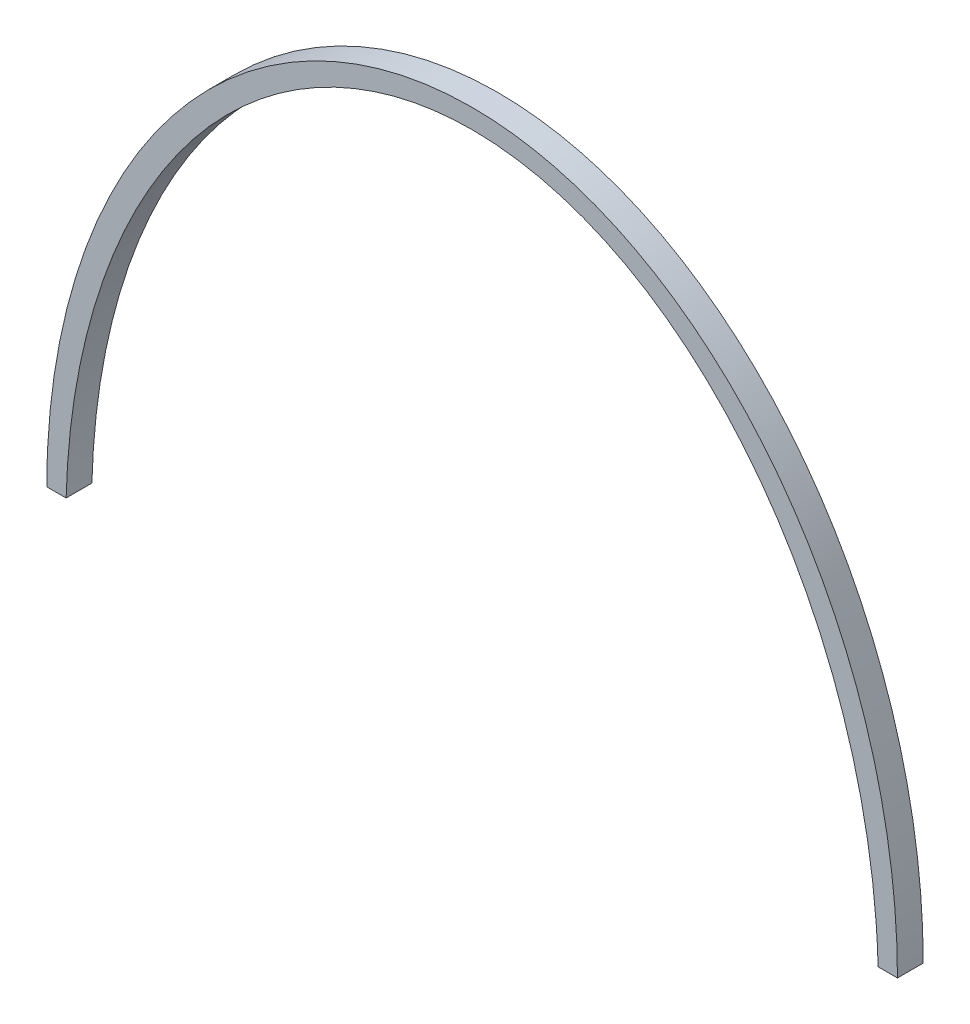
ISO-10303-21;
HEADER;
FILE_DESCRIPTION(('STEP AP214'),'2;1');
FILE_NAME('part.step','',(''),(''),'','','');
FILE_SCHEMA(('AUTOMOTIVE_DESIGN { 1 0 10303 214 1 1 1 1 }'));
ENDSEC;
DATA;
#1=APPLICATION_CONTEXT('core data for automotive mechanical design processes');
#2=APPLICATION_PROTOCOL_DEFINITION('international standard','automotive_design',2000,#1);
#3=PRODUCT_CONTEXT('',#1,'mechanical');
#4=PRODUCT('Part','Part','',(#3));
#5=PRODUCT_RELATED_PRODUCT_CATEGORY('part','',(#4));
#6=PRODUCT_DEFINITION_FORMATION('','',#4);
#7=PRODUCT_DEFINITION_CONTEXT('part definition',#1,'design');
#8=PRODUCT_DEFINITION('design','',#6,#7);
#9=PRODUCT_DEFINITION_SHAPE('','',#8);
#10=(LENGTH_UNIT() NAMED_UNIT(*) SI_UNIT(.MILLI.,.METRE.));
#11=(NAMED_UNIT(*) PLANE_ANGLE_UNIT() SI_UNIT($,.RADIAN.));
#12=(NAMED_UNIT(*) SI_UNIT($,.STERADIAN.) SOLID_ANGLE_UNIT());
#13=UNCERTAINTY_MEASURE_WITH_UNIT(LENGTH_MEASURE(1.E-05),#10,'distance_accuracy_value','');
#14=(GEOMETRIC_REPRESENTATION_CONTEXT(3) GLOBAL_UNCERTAINTY_ASSIGNED_CONTEXT((#13)) GLOBAL_UNIT_ASSIGNED_CONTEXT((#10,
#11,#12)) REPRESENTATION_CONTEXT('',''));
#15=CARTESIAN_POINT('',(0.,0.,0.));
#16=DIRECTION('',(0.,0.,1.));
#17=DIRECTION('',(1.,0.,0.));
#18=AXIS2_PLACEMENT_3D('',#15,#16,#17);
#19=CARTESIAN_POINT('',(2.17766099008993E-13,-19.05,12.7));
#20=DIRECTION('',(0.,0.,-1.));
#21=DIRECTION('',(0.,-1.,0.));
#22=AXIS2_PLACEMENT_3D('',#19,#20,#21);
#23=ELLIPSE('',#22,533.4,400.305378257736);
#24=DIRECTION('',(0.,0.,-1.));
#25=VECTOR('',#24,1.);
#26=SURFACE_OF_LINEAR_EXTRUSION('',#23,#25);
#27=CARTESIAN_POINT('',(2.17766099008993E-13,-19.05,-12.7));
#28=DIRECTION('',(0.,0.,-1.));
#29=DIRECTION('',(0.,-1.,0.));
#30=AXIS2_PLACEMENT_3D('',#27,#28,#29);
#31=ELLIPSE('',#30,533.4,400.305378257736);
#32=CARTESIAN_POINT('',(-400.05,0.,-12.7));
#33=VERTEX_POINT('',#32);
#34=CARTESIAN_POINT('',(400.05,0.,-12.7));
#35=VERTEX_POINT('',#34);
#36=EDGE_CURVE('E114',#33,#35,#31,.T.);
#37=ORIENTED_EDGE('',*,*,#36,.T.);
#38=DIRECTION('',(0.,0.,-1.));
#39=VECTOR('',#38,1.);
#40=CARTESIAN_POINT('',(400.05,0.,12.7));
#41=LINE('',#40,#39);
#42=CARTESIAN_POINT('',(400.05,0.,12.7));
#43=VERTEX_POINT('',#42);
#44=EDGE_CURVE('E11',#43,#35,#41,.T.);
#45=ORIENTED_EDGE('',*,*,#44,.F.);
#46=CARTESIAN_POINT('',(-400.05,0.,12.7));
#47=VERTEX_POINT('',#46);
#48=EDGE_CURVE('E88',#47,#43,#23,.T.);
#49=ORIENTED_EDGE('',*,*,#48,.F.);
#50=DIRECTION('',(0.,0.,-1.));
#51=VECTOR('',#50,1.);
#52=CARTESIAN_POINT('',(-400.05,0.,12.7));
#53=LINE('',#52,#51);
#54=EDGE_CURVE('E96',#47,#33,#53,.T.);
#55=ORIENTED_EDGE('',*,*,#54,.T.);
#56=EDGE_LOOP('',(#37,#45,#49,#55));
#57=FACE_BOUND('',#56,.T.);
#58=ADVANCED_FACE('F36',(#57),#26,.F.);
#59=CARTESIAN_POINT('',(400.05,0.,12.7));
#60=DIRECTION('',(0.,1.,0.));
#61=DIRECTION('',(-1.,0.,0.));
#62=AXIS2_PLACEMENT_3D('',#59,#60,#61);
#63=PLANE('',#62);
#64=DIRECTION('',(1.,0.,0.));
#65=VECTOR('',#64,1.);
#66=CARTESIAN_POINT('',(400.05,0.,-12.7));
#67=LINE('',#66,#65);
#68=CARTESIAN_POINT('',(419.1,0.,-12.7));
#69=VERTEX_POINT('',#68);
#70=EDGE_CURVE('E92',#35,#69,#67,.T.);
#71=ORIENTED_EDGE('',*,*,#70,.T.);
#72=DIRECTION('',(0.,0.,-1.));
#73=VECTOR('',#72,1.);
#74=CARTESIAN_POINT('',(419.1,0.,12.7));
#75=LINE('',#74,#73);
#76=CARTESIAN_POINT('',(419.1,0.,12.7));
#77=VERTEX_POINT('',#76);
#78=EDGE_CURVE('E45',#77,#69,#75,.T.);
#79=ORIENTED_EDGE('',*,*,#78,.F.);
#80=DIRECTION('',(1.,0.,0.));
#81=VECTOR('',#80,1.);
#82=CARTESIAN_POINT('',(400.05,0.,12.7));
#83=LINE('',#82,#81);
#84=EDGE_CURVE('E83',#43,#77,#83,.T.);
#85=ORIENTED_EDGE('',*,*,#84,.F.);
#86=ORIENTED_EDGE('',*,*,#44,.T.);
#87=EDGE_LOOP('',(#71,#79,#85,#86));
#88=FACE_BOUND('',#87,.T.);
#89=ADVANCED_FACE('F91',(#88),#63,.F.);
#90=CARTESIAN_POINT('',(2.22044604925031E-13,0.,12.7));
#91=DIRECTION('',(0.,0.,1.));
#92=DIRECTION('',(0.,-1.,0.));
#93=AXIS2_PLACEMENT_3D('',#90,#91,#92);
#94=ELLIPSE('',#93,533.4,419.1);
#95=DIRECTION('',(0.,0.,-1.));
#96=VECTOR('',#95,1.);
#97=SURFACE_OF_LINEAR_EXTRUSION('',#94,#96);
#98=CARTESIAN_POINT('',(2.22044604925031E-13,0.,-12.7));
#99=DIRECTION('',(0.,0.,1.));
#100=DIRECTION('',(0.,-1.,0.));
#101=AXIS2_PLACEMENT_3D('',#98,#99,#100);
#102=ELLIPSE('',#101,533.4,419.1);
#103=CARTESIAN_POINT('',(-419.1,0.,-12.7));
#104=VERTEX_POINT('',#103);
#105=EDGE_CURVE('E70',#69,#104,#102,.T.);
#106=ORIENTED_EDGE('',*,*,#105,.T.);
#107=DIRECTION('',(0.,0.,-1.));
#108=VECTOR('',#107,1.);
#109=CARTESIAN_POINT('',(-419.1,0.,12.7));
#110=LINE('',#109,#108);
#111=CARTESIAN_POINT('',(-419.1,0.,12.7));
#112=VERTEX_POINT('',#111);
#113=EDGE_CURVE('E93',#112,#104,#110,.T.);
#114=ORIENTED_EDGE('',*,*,#113,.F.);
#115=EDGE_CURVE('E86',#77,#112,#94,.T.);
#116=ORIENTED_EDGE('',*,*,#115,.F.);
#117=ORIENTED_EDGE('',*,*,#78,.T.);
#118=EDGE_LOOP('',(#106,#114,#116,#117));
#119=FACE_BOUND('',#118,.T.);
#120=ADVANCED_FACE('F94',(#119),#97,.F.);
#121=CARTESIAN_POINT('',(-419.1,0.,12.7));
#122=DIRECTION('',(0.,1.,0.));
#123=DIRECTION('',(-1.,0.,0.));
#124=AXIS2_PLACEMENT_3D('',#121,#122,#123);
#125=PLANE('',#124);
#126=DIRECTION('',(1.,0.,0.));
#127=VECTOR('',#126,1.);
#128=CARTESIAN_POINT('',(-419.1,0.,-12.7));
#129=LINE('',#128,#127);
#130=EDGE_CURVE('E76',#104,#33,#129,.T.);
#131=ORIENTED_EDGE('',*,*,#130,.T.);
#132=ORIENTED_EDGE('',*,*,#54,.F.);
#133=DIRECTION('',(1.,0.,0.));
#134=VECTOR('',#133,1.);
#135=CARTESIAN_POINT('',(-419.1,0.,12.7));
#136=LINE('',#135,#134);
#137=EDGE_CURVE('E53',#112,#47,#136,.T.);
#138=ORIENTED_EDGE('',*,*,#137,.F.);
#139=ORIENTED_EDGE('',*,*,#113,.T.);
#140=EDGE_LOOP('',(#131,#132,#138,#139));
#141=FACE_BOUND('',#140,.T.);
#142=ADVANCED_FACE('F103',(#141),#125,.F.);
#143=CARTESIAN_POINT('',(2.17766099008993E-13,-19.05,12.7));
#144=DIRECTION('',(0.,0.,1.));
#145=DIRECTION('',(1.,0.,0.));
#146=AXIS2_PLACEMENT_3D('',#143,#144,#145);
#147=PLANE('',#146);
#148=ORIENTED_EDGE('',*,*,#48,.T.);
#149=ORIENTED_EDGE('',*,*,#84,.T.);
#150=ORIENTED_EDGE('',*,*,#115,.T.);
#151=ORIENTED_EDGE('',*,*,#137,.T.);
#152=EDGE_LOOP('',(#148,#149,#150,#151));
#153=FACE_BOUND('',#152,.T.);
#154=ADVANCED_FACE('F84',(#153),#147,.T.);
#155=CARTESIAN_POINT('',(2.17766099008993E-13,-19.05,-12.7));
#156=DIRECTION('',(0.,0.,1.));
#157=DIRECTION('',(1.,0.,0.));
#158=AXIS2_PLACEMENT_3D('',#155,#156,#157);
#159=PLANE('',#158);
#160=ORIENTED_EDGE('',*,*,#36,.F.);
#161=ORIENTED_EDGE('',*,*,#130,.F.);
#162=ORIENTED_EDGE('',*,*,#105,.F.);
#163=ORIENTED_EDGE('',*,*,#70,.F.);
#164=EDGE_LOOP('',(#160,#161,#162,#163));
#165=FACE_BOUND('',#164,.T.);
#166=ADVANCED_FACE('F121',(#165),#159,.F.);
#167=CLOSED_SHELL('',(#58,#89,#120,#142,#154,#166));
#168=MANIFOLD_SOLID_BREP('B2',#167);
#169=ADVANCED_BREP_SHAPE_REPRESENTATION('',(#18,#168),#14);
#170=SHAPE_DEFINITION_REPRESENTATION(#9,#169);
ENDSEC;
END-ISO-10303-21;
